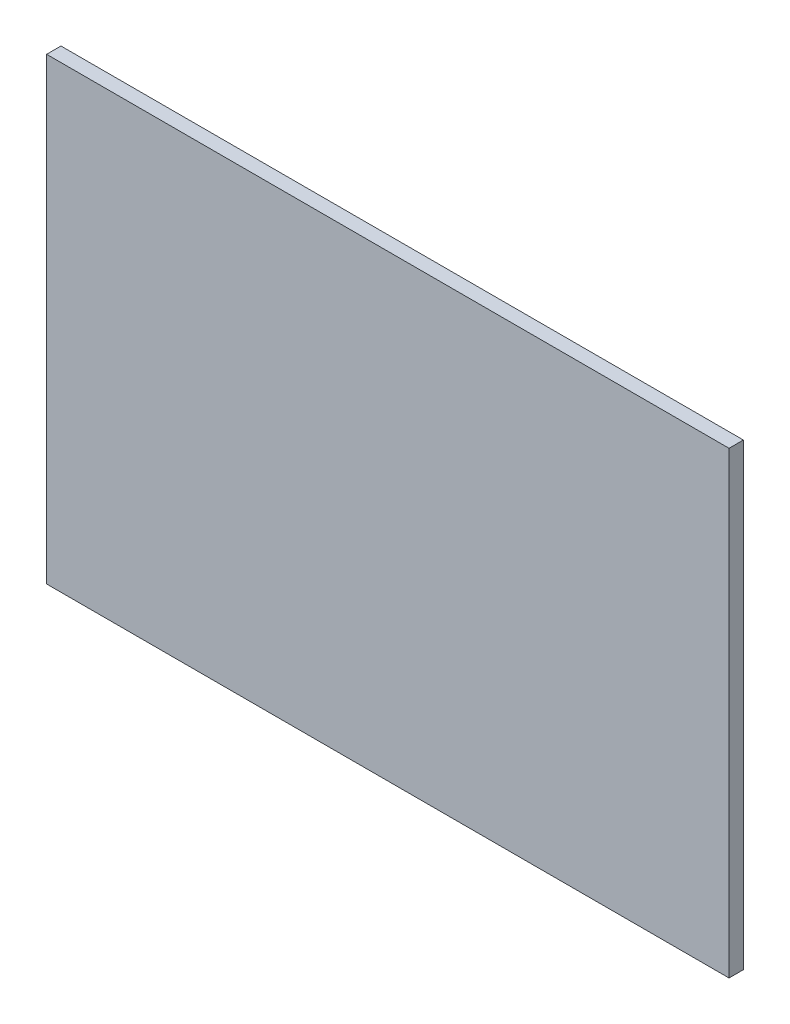
ISO-10303-21;
HEADER;
FILE_DESCRIPTION(('STEP AP214'),'2;1');
FILE_NAME('part.step','',(''),(''),'','','');
FILE_SCHEMA(('AUTOMOTIVE_DESIGN { 1 0 10303 214 1 1 1 1 }'));
ENDSEC;
DATA;
#1=APPLICATION_CONTEXT('core data for automotive mechanical design processes');
#2=APPLICATION_PROTOCOL_DEFINITION('international standard','automotive_design',2000,#1);
#3=PRODUCT_CONTEXT('',#1,'mechanical');
#4=PRODUCT('Part','Part','',(#3));
#5=PRODUCT_RELATED_PRODUCT_CATEGORY('part','',(#4));
#6=PRODUCT_DEFINITION_FORMATION('','',#4);
#7=PRODUCT_DEFINITION_CONTEXT('part definition',#1,'design');
#8=PRODUCT_DEFINITION('design','',#6,#7);
#9=PRODUCT_DEFINITION_SHAPE('','',#8);
#10=(LENGTH_UNIT() NAMED_UNIT(*) SI_UNIT(.MILLI.,.METRE.));
#11=(NAMED_UNIT(*) PLANE_ANGLE_UNIT() SI_UNIT($,.RADIAN.));
#12=(NAMED_UNIT(*) SI_UNIT($,.STERADIAN.) SOLID_ANGLE_UNIT());
#13=UNCERTAINTY_MEASURE_WITH_UNIT(LENGTH_MEASURE(1.E-05),#10,'distance_accuracy_value','');
#14=(GEOMETRIC_REPRESENTATION_CONTEXT(3) GLOBAL_UNCERTAINTY_ASSIGNED_CONTEXT((#13)) GLOBAL_UNIT_ASSIGNED_CONTEXT((#10,
#11,#12)) REPRESENTATION_CONTEXT('',''));
#15=CARTESIAN_POINT('',(0.,0.,0.));
#16=DIRECTION('',(0.,0.,1.));
#17=DIRECTION('',(1.,0.,0.));
#18=AXIS2_PLACEMENT_3D('',#15,#16,#17);
#19=CARTESIAN_POINT('',(-75.565,-50.8,3.175));
#20=DIRECTION('',(1.,0.,0.));
#21=DIRECTION('',(0.,0.,-1.));
#22=AXIS2_PLACEMENT_3D('',#19,#20,#21);
#23=PLANE('',#22);
#24=DIRECTION('',(0.,-1.,0.));
#25=VECTOR('',#24,1.);
#26=CARTESIAN_POINT('',(-75.565,-50.8,0.));
#27=LINE('',#26,#25);
#28=CARTESIAN_POINT('',(-75.565,50.8,0.));
#29=VERTEX_POINT('',#28);
#30=CARTESIAN_POINT('',(-75.565,-50.8,0.));
#31=VERTEX_POINT('',#30);
#32=EDGE_CURVE('E107',#29,#31,#27,.T.);
#33=ORIENTED_EDGE('',*,*,#32,.T.);
#34=DIRECTION('',(0.,0.,-1.));
#35=VECTOR('',#34,1.);
#36=CARTESIAN_POINT('',(-75.565,-50.8,3.175));
#37=LINE('',#36,#35);
#38=CARTESIAN_POINT('',(-75.565,-50.8,3.175));
#39=VERTEX_POINT('',#38);
#40=EDGE_CURVE('E11',#39,#31,#37,.T.);
#41=ORIENTED_EDGE('',*,*,#40,.F.);
#42=DIRECTION('',(0.,-1.,0.));
#43=VECTOR('',#42,1.);
#44=CARTESIAN_POINT('',(-75.565,-50.8,3.175));
#45=LINE('',#44,#43);
#46=CARTESIAN_POINT('',(-75.565,50.8,3.175));
#47=VERTEX_POINT('',#46);
#48=EDGE_CURVE('E91',#47,#39,#45,.T.);
#49=ORIENTED_EDGE('',*,*,#48,.F.);
#50=DIRECTION('',(0.,0.,-1.));
#51=VECTOR('',#50,1.);
#52=CARTESIAN_POINT('',(-75.565,50.8,3.175));
#53=LINE('',#52,#51);
#54=EDGE_CURVE('E103',#47,#29,#53,.T.);
#55=ORIENTED_EDGE('',*,*,#54,.T.);
#56=EDGE_LOOP('',(#33,#41,#49,#55));
#57=FACE_BOUND('',#56,.T.);
#58=ADVANCED_FACE('F39',(#57),#23,.F.);
#59=CARTESIAN_POINT('',(75.565,-50.8,3.175));
#60=DIRECTION('',(0.,1.,0.));
#61=DIRECTION('',(-1.,0.,0.));
#62=AXIS2_PLACEMENT_3D('',#59,#60,#61);
#63=PLANE('',#62);
#64=DIRECTION('',(1.,0.,0.));
#65=VECTOR('',#64,1.);
#66=CARTESIAN_POINT('',(75.565,-50.8,0.));
#67=LINE('',#66,#65);
#68=CARTESIAN_POINT('',(75.565,-50.8,0.));
#69=VERTEX_POINT('',#68);
#70=EDGE_CURVE('E96',#31,#69,#67,.T.);
#71=ORIENTED_EDGE('',*,*,#70,.T.);
#72=DIRECTION('',(0.,0.,-1.));
#73=VECTOR('',#72,1.);
#74=CARTESIAN_POINT('',(75.565,-50.8,3.175));
#75=LINE('',#74,#73);
#76=CARTESIAN_POINT('',(75.565,-50.8,3.175));
#77=VERTEX_POINT('',#76);
#78=EDGE_CURVE('E48',#77,#69,#75,.T.);
#79=ORIENTED_EDGE('',*,*,#78,.F.);
#80=DIRECTION('',(1.,0.,0.));
#81=VECTOR('',#80,1.);
#82=CARTESIAN_POINT('',(75.565,-50.8,3.175));
#83=LINE('',#82,#81);
#84=EDGE_CURVE('E86',#39,#77,#83,.T.);
#85=ORIENTED_EDGE('',*,*,#84,.F.);
#86=ORIENTED_EDGE('',*,*,#40,.T.);
#87=EDGE_LOOP('',(#71,#79,#85,#86));
#88=FACE_BOUND('',#87,.T.);
#89=ADVANCED_FACE('F95',(#88),#63,.F.);
#90=CARTESIAN_POINT('',(75.565,-50.8,3.175));
#91=DIRECTION('',(-1.,0.,0.));
#92=DIRECTION('',(0.,0.,1.));
#93=AXIS2_PLACEMENT_3D('',#90,#91,#92);
#94=PLANE('',#93);
#95=DIRECTION('',(0.,1.,0.));
#96=VECTOR('',#95,1.);
#97=CARTESIAN_POINT('',(75.565,-50.8,0.));
#98=LINE('',#97,#96);
#99=CARTESIAN_POINT('',(75.565,50.8,0.));
#100=VERTEX_POINT('',#99);
#101=EDGE_CURVE('E73',#69,#100,#98,.T.);
#102=ORIENTED_EDGE('',*,*,#101,.T.);
#103=DIRECTION('',(0.,0.,-1.));
#104=VECTOR('',#103,1.);
#105=CARTESIAN_POINT('',(75.565,50.8,3.175));
#106=LINE('',#105,#104);
#107=CARTESIAN_POINT('',(75.565,50.8,3.175));
#108=VERTEX_POINT('',#107);
#109=EDGE_CURVE('E98',#108,#100,#106,.T.);
#110=ORIENTED_EDGE('',*,*,#109,.F.);
#111=DIRECTION('',(0.,1.,0.));
#112=VECTOR('',#111,1.);
#113=CARTESIAN_POINT('',(75.565,-50.8,3.175));
#114=LINE('',#113,#112);
#115=EDGE_CURVE('E89',#77,#108,#114,.T.);
#116=ORIENTED_EDGE('',*,*,#115,.F.);
#117=ORIENTED_EDGE('',*,*,#78,.T.);
#118=EDGE_LOOP('',(#102,#110,#116,#117));
#119=FACE_BOUND('',#118,.T.);
#120=ADVANCED_FACE('F99',(#119),#94,.F.);
#121=CARTESIAN_POINT('',(75.565,50.8,3.175));
#122=DIRECTION('',(0.,-1.,0.));
#123=DIRECTION('',(1.,0.,0.));
#124=AXIS2_PLACEMENT_3D('',#121,#122,#123);
#125=PLANE('',#124);
#126=DIRECTION('',(-1.,0.,0.));
#127=VECTOR('',#126,1.);
#128=CARTESIAN_POINT('',(75.565,50.8,0.));
#129=LINE('',#128,#127);
#130=EDGE_CURVE('E79',#100,#29,#129,.T.);
#131=ORIENTED_EDGE('',*,*,#130,.T.);
#132=ORIENTED_EDGE('',*,*,#54,.F.);
#133=DIRECTION('',(-1.,0.,0.));
#134=VECTOR('',#133,1.);
#135=CARTESIAN_POINT('',(75.565,50.8,3.175));
#136=LINE('',#135,#134);
#137=EDGE_CURVE('E56',#108,#47,#136,.T.);
#138=ORIENTED_EDGE('',*,*,#137,.F.);
#139=ORIENTED_EDGE('',*,*,#109,.T.);
#140=EDGE_LOOP('',(#131,#132,#138,#139));
#141=FACE_BOUND('',#140,.T.);
#142=ADVANCED_FACE('F120',(#141),#125,.F.);
#143=CARTESIAN_POINT('',(0.,0.,3.175));
#144=DIRECTION('',(0.,0.,1.));
#145=DIRECTION('',(1.,0.,0.));
#146=AXIS2_PLACEMENT_3D('',#143,#144,#145);
#147=PLANE('',#146);
#148=ORIENTED_EDGE('',*,*,#48,.T.);
#149=ORIENTED_EDGE('',*,*,#84,.T.);
#150=ORIENTED_EDGE('',*,*,#115,.T.);
#151=ORIENTED_EDGE('',*,*,#137,.T.);
#152=EDGE_LOOP('',(#148,#149,#150,#151));
#153=FACE_BOUND('',#152,.T.);
#154=ADVANCED_FACE('F87',(#153),#147,.T.);
#155=CARTESIAN_POINT('',(0.,0.,0.));
#156=DIRECTION('',(0.,0.,1.));
#157=DIRECTION('',(1.,0.,0.));
#158=AXIS2_PLACEMENT_3D('',#155,#156,#157);
#159=PLANE('',#158);
#160=ORIENTED_EDGE('',*,*,#32,.F.);
#161=ORIENTED_EDGE('',*,*,#130,.F.);
#162=ORIENTED_EDGE('',*,*,#101,.F.);
#163=ORIENTED_EDGE('',*,*,#70,.F.);
#164=EDGE_LOOP('',(#160,#161,#162,#163));
#165=FACE_BOUND('',#164,.T.);
#166=ADVANCED_FACE('F123',(#165),#159,.F.);
#167=CLOSED_SHELL('',(#58,#89,#120,#142,#154,#166));
#168=MANIFOLD_SOLID_BREP('B2',#167);
#169=ADVANCED_BREP_SHAPE_REPRESENTATION('',(#18,#168),#14);
#170=SHAPE_DEFINITION_REPRESENTATION(#9,#169);
ENDSEC;
END-ISO-10303-21;
